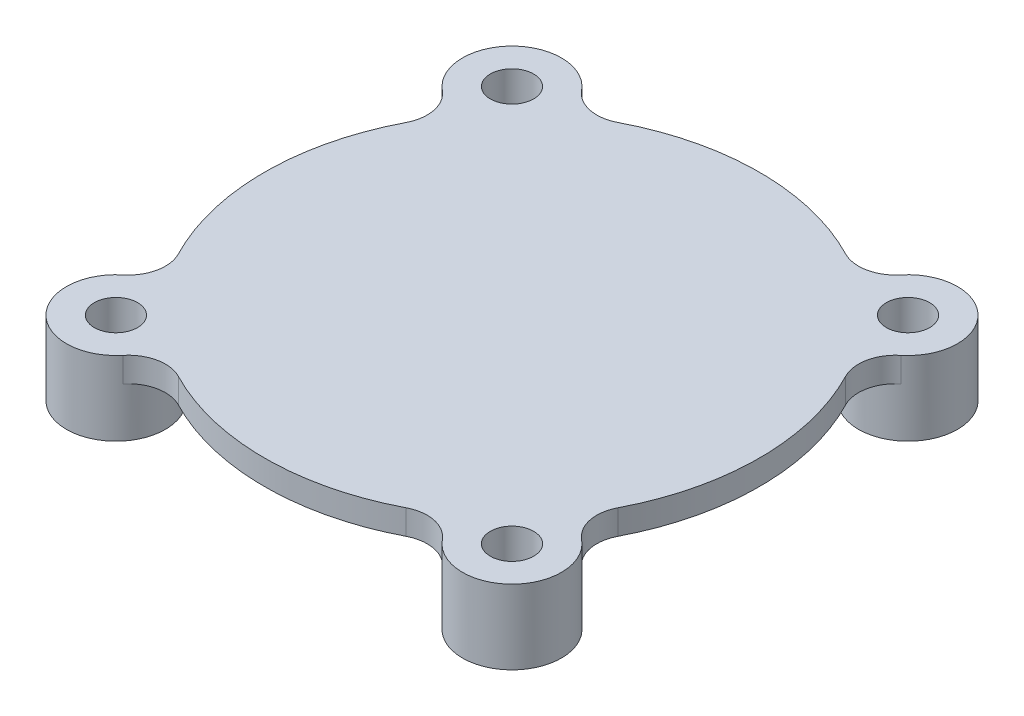
ISO-10303-21;
HEADER;
FILE_DESCRIPTION(('STEP AP214'),'2;1');
FILE_NAME('part.step','',(''),(''),'','','');
FILE_SCHEMA(('AUTOMOTIVE_DESIGN { 1 0 10303 214 1 1 1 1 }'));
ENDSEC;
DATA;
#1=APPLICATION_CONTEXT('core data for automotive mechanical design processes');
#2=APPLICATION_PROTOCOL_DEFINITION('international standard','automotive_design',2000,#1);
#3=PRODUCT_CONTEXT('',#1,'mechanical');
#4=PRODUCT('Part','Part','',(#3));
#5=PRODUCT_RELATED_PRODUCT_CATEGORY('part','',(#4));
#6=PRODUCT_DEFINITION_FORMATION('','',#4);
#7=PRODUCT_DEFINITION_CONTEXT('part definition',#1,'design');
#8=PRODUCT_DEFINITION('design','',#6,#7);
#9=PRODUCT_DEFINITION_SHAPE('','',#8);
#10=(LENGTH_UNIT() NAMED_UNIT(*) SI_UNIT(.MILLI.,.METRE.));
#11=(NAMED_UNIT(*) PLANE_ANGLE_UNIT() SI_UNIT($,.RADIAN.));
#12=(NAMED_UNIT(*) SI_UNIT($,.STERADIAN.) SOLID_ANGLE_UNIT());
#13=UNCERTAINTY_MEASURE_WITH_UNIT(LENGTH_MEASURE(1.E-05),#10,'distance_accuracy_value','');
#14=(GEOMETRIC_REPRESENTATION_CONTEXT(3) GLOBAL_UNCERTAINTY_ASSIGNED_CONTEXT((#13)) GLOBAL_UNIT_ASSIGNED_CONTEXT((#10,
#11,#12)) REPRESENTATION_CONTEXT('',''));
#15=CARTESIAN_POINT('',(0.,0.,0.));
#16=DIRECTION('',(0.,0.,1.));
#17=DIRECTION('',(1.,0.,0.));
#18=AXIS2_PLACEMENT_3D('',#15,#16,#17);
#19=CARTESIAN_POINT('',(-16.,2.,16.));
#20=DIRECTION('',(0.,-1.,0.));
#21=DIRECTION('',(0.,0.,-1.));
#22=AXIS2_PLACEMENT_3D('',#19,#20,#21);
#23=CYLINDRICAL_SURFACE('',#22,4.00000000000022);
#24=CARTESIAN_POINT('',(-16.,2.,16.));
#25=DIRECTION('',(0.,1.,0.));
#26=DIRECTION('',(0.,0.,1.));
#27=AXIS2_PLACEMENT_3D('',#24,#25,#26);
#28=CIRCLE('',#27,4.00000000000022);
#29=CARTESIAN_POINT('',(-18.5282450862276,2.,12.9003263423438));
#30=VERTEX_POINT('',#29);
#31=CARTESIAN_POINT('',(-12.9003263423438,2.,18.5282450862276));
#32=VERTEX_POINT('',#31);
#33=EDGE_CURVE('E175',#30,#32,#28,.T.);
#34=ORIENTED_EDGE('',*,*,#33,.F.);
#35=DIRECTION('',(0.,-1.,0.));
#36=VECTOR('',#35,1.);
#37=CARTESIAN_POINT('',(-18.5282450862276,2.,12.9003263423438));
#38=LINE('',#37,#36);
#39=CARTESIAN_POINT('',(-18.5282450862276,0.,12.9003263423438));
#40=VERTEX_POINT('',#39);
#41=EDGE_CURVE('E169',#30,#40,#38,.T.);
#42=ORIENTED_EDGE('',*,*,#41,.T.);
#43=CARTESIAN_POINT('',(-16.,0.,16.));
#44=DIRECTION('',(0.,1.,0.));
#45=DIRECTION('',(0.,0.,1.));
#46=AXIS2_PLACEMENT_3D('',#43,#44,#45);
#47=CIRCLE('',#46,4.00000000000022);
#48=CARTESIAN_POINT('',(-12.9003263423438,0.,18.5282450862276));
#49=VERTEX_POINT('',#48);
#50=EDGE_CURVE('E150',#49,#40,#47,.T.);
#51=ORIENTED_EDGE('',*,*,#50,.F.);
#52=DIRECTION('',(0.,-1.,0.));
#53=VECTOR('',#52,1.);
#54=CARTESIAN_POINT('',(-12.9003263423438,2.,18.5282450862276));
#55=LINE('',#54,#53);
#56=EDGE_CURVE('E177',#49,#32,#55,.F.);
#57=ORIENTED_EDGE('',*,*,#56,.T.);
#58=EDGE_LOOP('',(#34,#42,#51,#57));
#59=FACE_BOUND('',#58,.T.);
#60=CARTESIAN_POINT('',(-16.,-4.,16.));
#61=DIRECTION('',(0.,1.,0.));
#62=DIRECTION('',(0.,0.,1.));
#63=AXIS2_PLACEMENT_3D('',#60,#61,#62);
#64=CIRCLE('',#63,4.00000000000022);
#65=CARTESIAN_POINT('',(-16.,-4.,20.0000000000002));
#66=VERTEX_POINT('',#65);
#67=EDGE_CURVE('E162',#66,#66,#64,.T.);
#68=ORIENTED_EDGE('',*,*,#67,.T.);
#69=EDGE_LOOP('',(#68));
#70=FACE_BOUND('',#69,.T.);
#71=ADVANCED_FACE('F37',(#59,#70),#23,.T.);
#72=CARTESIAN_POINT('',(0.,2.,0.));
#73=DIRECTION('',(0.,-1.,0.));
#74=DIRECTION('',(0.,0.,-1.));
#75=AXIS2_PLACEMENT_3D('',#72,#73,#74);
#76=CYLINDRICAL_SURFACE('',#75,20.);
#77=CARTESIAN_POINT('',(0.,0.,0.));
#78=DIRECTION('',(0.,1.,0.));
#79=DIRECTION('',(0.,0.,1.));
#80=AXIS2_PLACEMENT_3D('',#77,#78,#79);
#81=CIRCLE('',#80,20.);
#82=CARTESIAN_POINT('',(-9.19614878182761,0.,17.7603729573027));
#83=VERTEX_POINT('',#82);
#84=CARTESIAN_POINT('',(9.19614878182767,0.,17.7603729573027));
#85=VERTEX_POINT('',#84);
#86=EDGE_CURVE('E274',#83,#85,#81,.T.);
#87=ORIENTED_EDGE('',*,*,#86,.T.);
#88=DIRECTION('',(0.,-1.,0.));
#89=VECTOR('',#88,1.);
#90=CARTESIAN_POINT('',(9.19614878182767,2.,17.7603729573027));
#91=LINE('',#90,#89);
#92=CARTESIAN_POINT('',(9.19614878182767,2.,17.7603729573027));
#93=VERTEX_POINT('',#92);
#94=EDGE_CURVE('E52',#85,#93,#91,.F.);
#95=ORIENTED_EDGE('',*,*,#94,.T.);
#96=CARTESIAN_POINT('',(0.,2.,0.));
#97=DIRECTION('',(0.,1.,0.));
#98=DIRECTION('',(0.,0.,1.));
#99=AXIS2_PLACEMENT_3D('',#96,#97,#98);
#100=CIRCLE('',#99,20.);
#101=CARTESIAN_POINT('',(-9.19614878182761,2.,17.7603729573027));
#102=VERTEX_POINT('',#101);
#103=EDGE_CURVE('E269',#102,#93,#100,.T.);
#104=ORIENTED_EDGE('',*,*,#103,.F.);
#105=DIRECTION('',(0.,-1.,0.));
#106=VECTOR('',#105,1.);
#107=CARTESIAN_POINT('',(-9.19614878182761,2.,17.7603729573027));
#108=LINE('',#107,#106);
#109=EDGE_CURVE('E211',#102,#83,#108,.T.);
#110=ORIENTED_EDGE('',*,*,#109,.T.);
#111=EDGE_LOOP('',(#87,#95,#104,#110));
#112=FACE_BOUND('',#111,.T.);
#113=ADVANCED_FACE('F376',(#112),#76,.T.);
#114=CARTESIAN_POINT('',(16.,2.,16.));
#115=DIRECTION('',(0.,-1.,0.));
#116=DIRECTION('',(0.,0.,-1.));
#117=AXIS2_PLACEMENT_3D('',#114,#115,#116);
#118=CYLINDRICAL_SURFACE('',#117,4.00000000000016);
#119=DIRECTION('',(0.,-1.,0.));
#120=VECTOR('',#119,1.);
#121=CARTESIAN_POINT('',(12.9003263423438,2.,18.5282450862275));
#122=LINE('',#121,#120);
#123=CARTESIAN_POINT('',(12.9003263423438,2.,18.5282450862275));
#124=VERTEX_POINT('',#123);
#125=CARTESIAN_POINT('',(12.9003263423438,0.,18.5282450862275));
#126=VERTEX_POINT('',#125);
#127=EDGE_CURVE('E206',#124,#126,#122,.T.);
#128=ORIENTED_EDGE('',*,*,#127,.T.);
#129=CARTESIAN_POINT('',(16.,0.,16.));
#130=DIRECTION('',(0.,1.,0.));
#131=DIRECTION('',(0.,0.,1.));
#132=AXIS2_PLACEMENT_3D('',#129,#130,#131);
#133=CIRCLE('',#132,4.00000000000016);
#134=CARTESIAN_POINT('',(18.5282450862275,0.,12.9003263423438));
#135=VERTEX_POINT('',#134);
#136=EDGE_CURVE('E278',#135,#126,#133,.T.);
#137=ORIENTED_EDGE('',*,*,#136,.F.);
#138=DIRECTION('',(0.,-1.,0.));
#139=VECTOR('',#138,1.);
#140=CARTESIAN_POINT('',(18.5282450862275,2.,12.9003263423438));
#141=LINE('',#140,#139);
#142=CARTESIAN_POINT('',(18.5282450862275,2.,12.9003263423438));
#143=VERTEX_POINT('',#142);
#144=EDGE_CURVE('E209',#135,#143,#141,.F.);
#145=ORIENTED_EDGE('',*,*,#144,.T.);
#146=CARTESIAN_POINT('',(16.,2.,16.));
#147=DIRECTION('',(0.,1.,0.));
#148=DIRECTION('',(0.,0.,1.));
#149=AXIS2_PLACEMENT_3D('',#146,#147,#148);
#150=CIRCLE('',#149,4.00000000000016);
#151=EDGE_CURVE('E282',#124,#143,#150,.T.);
#152=ORIENTED_EDGE('',*,*,#151,.F.);
#153=EDGE_LOOP('',(#128,#137,#145,#152));
#154=FACE_BOUND('',#153,.T.);
#155=CARTESIAN_POINT('',(16.,-4.,16.));
#156=DIRECTION('',(0.,1.,0.));
#157=DIRECTION('',(0.,0.,1.));
#158=AXIS2_PLACEMENT_3D('',#155,#156,#157);
#159=CIRCLE('',#158,4.00000000000016);
#160=CARTESIAN_POINT('',(16.,-4.,20.0000000000002));
#161=VERTEX_POINT('',#160);
#162=EDGE_CURVE('E275',#161,#161,#159,.T.);
#163=ORIENTED_EDGE('',*,*,#162,.T.);
#164=EDGE_LOOP('',(#163));
#165=FACE_BOUND('',#164,.T.);
#166=ADVANCED_FACE('F381',(#154,#165),#118,.T.);
#167=CARTESIAN_POINT('',(17.7603729573027,0.,9.19614878182765));
#168=VERTEX_POINT('',#167);
#169=CARTESIAN_POINT('',(17.7603729573027,0.,-9.19614878182772));
#170=VERTEX_POINT('',#169);
#171=EDGE_CURVE('E254',#168,#170,#81,.T.);
#172=ORIENTED_EDGE('',*,*,#171,.T.);
#173=DIRECTION('',(0.,-1.,0.));
#174=VECTOR('',#173,1.);
#175=CARTESIAN_POINT('',(17.7603729573027,2.,-9.19614878182772));
#176=LINE('',#175,#174);
#177=CARTESIAN_POINT('',(17.7603729573027,2.,-9.19614878182772));
#178=VERTEX_POINT('',#177);
#179=EDGE_CURVE('E204',#170,#178,#176,.F.);
#180=ORIENTED_EDGE('',*,*,#179,.T.);
#181=CARTESIAN_POINT('',(17.7603729573027,2.,9.19614878182765));
#182=VERTEX_POINT('',#181);
#183=EDGE_CURVE('E271',#182,#178,#100,.T.);
#184=ORIENTED_EDGE('',*,*,#183,.F.);
#185=DIRECTION('',(0.,-1.,0.));
#186=VECTOR('',#185,1.);
#187=CARTESIAN_POINT('',(17.7603729573027,2.,9.19614878182765));
#188=LINE('',#187,#186);
#189=EDGE_CURVE('E201',#182,#168,#188,.T.);
#190=ORIENTED_EDGE('',*,*,#189,.T.);
#191=EDGE_LOOP('',(#172,#180,#184,#190));
#192=FACE_BOUND('',#191,.T.);
#193=ADVANCED_FACE('F309',(#192),#76,.T.);
#194=CARTESIAN_POINT('',(16.,2.,-16.));
#195=DIRECTION('',(0.,-1.,0.));
#196=DIRECTION('',(0.,0.,-1.));
#197=AXIS2_PLACEMENT_3D('',#194,#195,#196);
#198=CYLINDRICAL_SURFACE('',#197,4.00000000000008);
#199=DIRECTION('',(0.,-1.,0.));
#200=VECTOR('',#199,1.);
#201=CARTESIAN_POINT('',(18.5282450862275,2.,-12.9003263423439));
#202=LINE('',#201,#200);
#203=CARTESIAN_POINT('',(18.5282450862275,2.,-12.9003263423439));
#204=VERTEX_POINT('',#203);
#205=CARTESIAN_POINT('',(18.5282450862275,0.,-12.9003263423439));
#206=VERTEX_POINT('',#205);
#207=EDGE_CURVE('E196',#204,#206,#202,.T.);
#208=ORIENTED_EDGE('',*,*,#207,.T.);
#209=CARTESIAN_POINT('',(16.,0.,-16.));
#210=DIRECTION('',(0.,1.,0.));
#211=DIRECTION('',(0.,0.,1.));
#212=AXIS2_PLACEMENT_3D('',#209,#210,#211);
#213=CIRCLE('',#212,4.00000000000008);
#214=CARTESIAN_POINT('',(12.9003263423439,0.,-18.5282450862275));
#215=VERTEX_POINT('',#214);
#216=EDGE_CURVE('E298',#215,#206,#213,.T.);
#217=ORIENTED_EDGE('',*,*,#216,.F.);
#218=DIRECTION('',(0.,-1.,0.));
#219=VECTOR('',#218,1.);
#220=CARTESIAN_POINT('',(12.9003263423439,2.,-18.5282450862275));
#221=LINE('',#220,#219);
#222=CARTESIAN_POINT('',(12.9003263423439,2.,-18.5282450862275));
#223=VERTEX_POINT('',#222);
#224=EDGE_CURVE('E199',#215,#223,#221,.F.);
#225=ORIENTED_EDGE('',*,*,#224,.T.);
#226=CARTESIAN_POINT('',(16.,2.,-16.));
#227=DIRECTION('',(0.,1.,0.));
#228=DIRECTION('',(0.,0.,1.));
#229=AXIS2_PLACEMENT_3D('',#226,#227,#228);
#230=CIRCLE('',#229,4.00000000000008);
#231=EDGE_CURVE('E270',#204,#223,#230,.T.);
#232=ORIENTED_EDGE('',*,*,#231,.F.);
#233=EDGE_LOOP('',(#208,#217,#225,#232));
#234=FACE_BOUND('',#233,.T.);
#235=CARTESIAN_POINT('',(16.,-4.,-16.));
#236=DIRECTION('',(0.,1.,0.));
#237=DIRECTION('',(0.,0.,1.));
#238=AXIS2_PLACEMENT_3D('',#235,#236,#237);
#239=CIRCLE('',#238,4.00000000000008);
#240=CARTESIAN_POINT('',(16.,-4.,-11.9999999999999));
#241=VERTEX_POINT('',#240);
#242=EDGE_CURVE('E301',#241,#241,#239,.T.);
#243=ORIENTED_EDGE('',*,*,#242,.T.);
#244=EDGE_LOOP('',(#243));
#245=FACE_BOUND('',#244,.T.);
#246=ADVANCED_FACE('F306',(#234,#245),#198,.T.);
#247=CARTESIAN_POINT('',(9.19614878182773,2.,-17.7603729573027));
#248=VERTEX_POINT('',#247);
#249=CARTESIAN_POINT('',(-9.19614878182778,2.,-17.7603729573027));
#250=VERTEX_POINT('',#249);
#251=EDGE_CURVE('E262',#248,#250,#100,.T.);
#252=ORIENTED_EDGE('',*,*,#251,.F.);
#253=DIRECTION('',(0.,-1.,0.));
#254=VECTOR('',#253,1.);
#255=CARTESIAN_POINT('',(9.19614878182773,2.,-17.7603729573027));
#256=LINE('',#255,#254);
#257=CARTESIAN_POINT('',(9.19614878182773,0.,-17.7603729573027));
#258=VERTEX_POINT('',#257);
#259=EDGE_CURVE('E193',#248,#258,#256,.T.);
#260=ORIENTED_EDGE('',*,*,#259,.T.);
#261=CARTESIAN_POINT('',(-9.19614878182778,0.,-17.7603729573027));
#262=VERTEX_POINT('',#261);
#263=EDGE_CURVE('E243',#258,#262,#81,.T.);
#264=ORIENTED_EDGE('',*,*,#263,.T.);
#265=DIRECTION('',(0.,-1.,0.));
#266=VECTOR('',#265,1.);
#267=CARTESIAN_POINT('',(-9.19614878182778,2.,-17.7603729573027));
#268=LINE('',#267,#266);
#269=EDGE_CURVE('E191',#262,#250,#268,.F.);
#270=ORIENTED_EDGE('',*,*,#269,.T.);
#271=EDGE_LOOP('',(#252,#260,#264,#270));
#272=FACE_BOUND('',#271,.T.);
#273=ADVANCED_FACE('F250',(#272),#76,.T.);
#274=CARTESIAN_POINT('',(-16.,2.,-16.));
#275=DIRECTION('',(0.,-1.,0.));
#276=DIRECTION('',(0.,0.,-1.));
#277=AXIS2_PLACEMENT_3D('',#274,#275,#276);
#278=CYLINDRICAL_SURFACE('',#277,4.);
#279=DIRECTION('',(0.,-1.,0.));
#280=VECTOR('',#279,1.);
#281=CARTESIAN_POINT('',(-12.900326342344,2.,-18.5282450862275));
#282=LINE('',#281,#280);
#283=CARTESIAN_POINT('',(-12.900326342344,2.,-18.5282450862275));
#284=VERTEX_POINT('',#283);
#285=CARTESIAN_POINT('',(-12.900326342344,0.,-18.5282450862275));
#286=VERTEX_POINT('',#285);
#287=EDGE_CURVE('E186',#284,#286,#282,.T.);
#288=ORIENTED_EDGE('',*,*,#287,.T.);
#289=CARTESIAN_POINT('',(-16.,0.,-16.));
#290=DIRECTION('',(0.,1.,0.));
#291=DIRECTION('',(0.,0.,1.));
#292=AXIS2_PLACEMENT_3D('',#289,#290,#291);
#293=CIRCLE('',#292,4.);
#294=CARTESIAN_POINT('',(-18.5282450862275,0.,-12.900326342344));
#295=VERTEX_POINT('',#294);
#296=EDGE_CURVE('E244',#295,#286,#293,.T.);
#297=ORIENTED_EDGE('',*,*,#296,.F.);
#298=DIRECTION('',(0.,-1.,0.));
#299=VECTOR('',#298,1.);
#300=CARTESIAN_POINT('',(-18.5282450862275,2.,-12.900326342344));
#301=LINE('',#300,#299);
#302=CARTESIAN_POINT('',(-18.5282450862275,2.,-12.900326342344));
#303=VERTEX_POINT('',#302);
#304=EDGE_CURVE('E189',#295,#303,#301,.F.);
#305=ORIENTED_EDGE('',*,*,#304,.T.);
#306=CARTESIAN_POINT('',(-16.,2.,-16.));
#307=DIRECTION('',(0.,1.,0.));
#308=DIRECTION('',(0.,0.,1.));
#309=AXIS2_PLACEMENT_3D('',#306,#307,#308);
#310=CIRCLE('',#309,4.);
#311=EDGE_CURVE('E260',#284,#303,#310,.T.);
#312=ORIENTED_EDGE('',*,*,#311,.F.);
#313=EDGE_LOOP('',(#288,#297,#305,#312));
#314=FACE_BOUND('',#313,.T.);
#315=CARTESIAN_POINT('',(-16.,-4.,-16.));
#316=DIRECTION('',(0.,1.,0.));
#317=DIRECTION('',(0.,0.,1.));
#318=AXIS2_PLACEMENT_3D('',#315,#316,#317);
#319=CIRCLE('',#318,4.);
#320=CARTESIAN_POINT('',(-16.,-4.,-12.));
#321=VERTEX_POINT('',#320);
#322=EDGE_CURVE('E161',#321,#321,#319,.T.);
#323=ORIENTED_EDGE('',*,*,#322,.T.);
#324=EDGE_LOOP('',(#323));
#325=FACE_BOUND('',#324,.T.);
#326=ADVANCED_FACE('F264',(#314,#325),#278,.T.);
#327=CARTESIAN_POINT('',(-17.7603729573027,0.,-9.19614878182778));
#328=VERTEX_POINT('',#327);
#329=CARTESIAN_POINT('',(-17.7603729573027,0.,9.19614878182762));
#330=VERTEX_POINT('',#329);
#331=EDGE_CURVE('E253',#328,#330,#81,.T.);
#332=ORIENTED_EDGE('',*,*,#331,.T.);
#333=DIRECTION('',(0.,-1.,0.));
#334=VECTOR('',#333,1.);
#335=CARTESIAN_POINT('',(-17.7603729573027,2.,9.19614878182762));
#336=LINE('',#335,#334);
#337=CARTESIAN_POINT('',(-17.7603729573027,2.,9.19614878182762));
#338=VERTEX_POINT('',#337);
#339=EDGE_CURVE('E170',#330,#338,#336,.F.);
#340=ORIENTED_EDGE('',*,*,#339,.T.);
#341=CARTESIAN_POINT('',(-17.7603729573027,2.,-9.19614878182778));
#342=VERTEX_POINT('',#341);
#343=EDGE_CURVE('E181',#342,#338,#100,.T.);
#344=ORIENTED_EDGE('',*,*,#343,.F.);
#345=DIRECTION('',(0.,-1.,0.));
#346=VECTOR('',#345,1.);
#347=CARTESIAN_POINT('',(-17.7603729573027,2.,-9.19614878182778));
#348=LINE('',#347,#346);
#349=EDGE_CURVE('E176',#342,#328,#348,.T.);
#350=ORIENTED_EDGE('',*,*,#349,.T.);
#351=EDGE_LOOP('',(#332,#340,#344,#350));
#352=FACE_BOUND('',#351,.T.);
#353=ADVANCED_FACE('F350',(#352),#76,.T.);
#354=CARTESIAN_POINT('',(0.,2.,0.));
#355=DIRECTION('',(0.,1.,0.));
#356=DIRECTION('',(0.,0.,1.));
#357=AXIS2_PLACEMENT_3D('',#354,#355,#356);
#358=PLANE('',#357);
#359=CARTESIAN_POINT('',(-16.,2.,-16.));
#360=DIRECTION('',(0.,1.,0.));
#361=DIRECTION('',(0.,0.,1.));
#362=AXIS2_PLACEMENT_3D('',#359,#360,#361);
#363=CIRCLE('',#362,1.74999999999999);
#364=CARTESIAN_POINT('',(-16.,2.,-14.25));
#365=VERTEX_POINT('',#364);
#366=EDGE_CURVE('E342',#365,#365,#363,.T.);
#367=ORIENTED_EDGE('',*,*,#366,.F.);
#368=EDGE_LOOP('',(#367));
#369=FACE_BOUND('',#368,.T.);
#370=CARTESIAN_POINT('',(16.,2.,-16.));
#371=DIRECTION('',(0.,1.,0.));
#372=DIRECTION('',(0.,0.,1.));
#373=AXIS2_PLACEMENT_3D('',#370,#371,#372);
#374=CIRCLE('',#373,1.74999999999999);
#375=CARTESIAN_POINT('',(16.,2.,-14.25));
#376=VERTEX_POINT('',#375);
#377=EDGE_CURVE('E336',#376,#376,#374,.T.);
#378=ORIENTED_EDGE('',*,*,#377,.F.);
#379=EDGE_LOOP('',(#378));
#380=FACE_BOUND('',#379,.T.);
#381=CARTESIAN_POINT('',(16.,2.,16.));
#382=DIRECTION('',(0.,1.,0.));
#383=DIRECTION('',(0.,0.,1.));
#384=AXIS2_PLACEMENT_3D('',#381,#382,#383);
#385=CIRCLE('',#384,1.74999999999999);
#386=CARTESIAN_POINT('',(16.,2.,17.75));
#387=VERTEX_POINT('',#386);
#388=EDGE_CURVE('E330',#387,#387,#385,.T.);
#389=ORIENTED_EDGE('',*,*,#388,.F.);
#390=EDGE_LOOP('',(#389));
#391=FACE_BOUND('',#390,.T.);
#392=CARTESIAN_POINT('',(-16.,2.,16.));
#393=DIRECTION('',(0.,1.,0.));
#394=DIRECTION('',(0.,0.,1.));
#395=AXIS2_PLACEMENT_3D('',#392,#393,#394);
#396=CIRCLE('',#395,1.74999999999999);
#397=CARTESIAN_POINT('',(-16.,2.,17.75));
#398=VERTEX_POINT('',#397);
#399=EDGE_CURVE('E324',#398,#398,#396,.T.);
#400=ORIENTED_EDGE('',*,*,#399,.F.);
#401=EDGE_LOOP('',(#400));
#402=FACE_BOUND('',#401,.T.);
#403=ORIENTED_EDGE('',*,*,#343,.T.);
#404=CARTESIAN_POINT('',(-20.4244289008982,2.,10.5755710991018));
#405=DIRECTION('',(0.,1.,0.));
#406=DIRECTION('',(0.,0.,1.));
#407=AXIS2_PLACEMENT_3D('',#404,#405,#406);
#408=CIRCLE('',#407,3.);
#409=EDGE_CURVE('E171',#338,#30,#408,.F.);
#410=ORIENTED_EDGE('',*,*,#409,.T.);
#411=ORIENTED_EDGE('',*,*,#33,.T.);
#412=CARTESIAN_POINT('',(-10.5755710991017,2.,20.4244289008982));
#413=DIRECTION('',(0.,1.,0.));
#414=DIRECTION('',(0.,0.,1.));
#415=AXIS2_PLACEMENT_3D('',#412,#413,#414);
#416=CIRCLE('',#415,3.);
#417=EDGE_CURVE('E59',#32,#102,#416,.F.);
#418=ORIENTED_EDGE('',*,*,#417,.T.);
#419=ORIENTED_EDGE('',*,*,#103,.T.);
#420=CARTESIAN_POINT('',(10.5755710991018,2.,20.4244289008981));
#421=DIRECTION('',(0.,1.,0.));
#422=DIRECTION('',(0.,0.,1.));
#423=AXIS2_PLACEMENT_3D('',#420,#421,#422);
#424=CIRCLE('',#423,3.);
#425=EDGE_CURVE('E237',#93,#124,#424,.F.);
#426=ORIENTED_EDGE('',*,*,#425,.T.);
#427=ORIENTED_EDGE('',*,*,#151,.T.);
#428=CARTESIAN_POINT('',(20.4244289008981,2.,10.5755710991018));
#429=DIRECTION('',(0.,1.,0.));
#430=DIRECTION('',(0.,0.,1.));
#431=AXIS2_PLACEMENT_3D('',#428,#429,#430);
#432=CIRCLE('',#431,3.);
#433=EDGE_CURVE('E233',#143,#182,#432,.F.);
#434=ORIENTED_EDGE('',*,*,#433,.T.);
#435=ORIENTED_EDGE('',*,*,#183,.T.);
#436=CARTESIAN_POINT('',(20.4244289008981,2.,-10.5755710991019));
#437=DIRECTION('',(0.,1.,0.));
#438=DIRECTION('',(0.,0.,1.));
#439=AXIS2_PLACEMENT_3D('',#436,#437,#438);
#440=CIRCLE('',#439,3.);
#441=EDGE_CURVE('E228',#178,#204,#440,.F.);
#442=ORIENTED_EDGE('',*,*,#441,.T.);
#443=ORIENTED_EDGE('',*,*,#231,.T.);
#444=CARTESIAN_POINT('',(10.5755710991019,2.,-20.4244289008981));
#445=DIRECTION('',(0.,1.,0.));
#446=DIRECTION('',(0.,0.,1.));
#447=AXIS2_PLACEMENT_3D('',#444,#445,#446);
#448=CIRCLE('',#447,3.);
#449=EDGE_CURVE('E224',#223,#248,#448,.F.);
#450=ORIENTED_EDGE('',*,*,#449,.T.);
#451=ORIENTED_EDGE('',*,*,#251,.T.);
#452=CARTESIAN_POINT('',(-10.5755710991019,2.,-20.4244289008981));
#453=DIRECTION('',(0.,1.,0.));
#454=DIRECTION('',(0.,0.,1.));
#455=AXIS2_PLACEMENT_3D('',#452,#453,#454);
#456=CIRCLE('',#455,3.);
#457=EDGE_CURVE('E11',#250,#284,#456,.F.);
#458=ORIENTED_EDGE('',*,*,#457,.T.);
#459=ORIENTED_EDGE('',*,*,#311,.T.);
#460=CARTESIAN_POINT('',(-20.4244289008981,2.,-10.575571099102));
#461=DIRECTION('',(0.,1.,0.));
#462=DIRECTION('',(0.,0.,1.));
#463=AXIS2_PLACEMENT_3D('',#460,#461,#462);
#464=CIRCLE('',#463,3.);
#465=EDGE_CURVE('E219',#303,#342,#464,.F.);
#466=ORIENTED_EDGE('',*,*,#465,.T.);
#467=EDGE_LOOP('',(#403,#410,#411,#418,#419,#426,#427,#434,#435,#442,#443,#450,#451,#458,#459,#466));
#468=FACE_BOUND('',#467,.T.);
#469=ADVANCED_FACE('F259',(#369,#380,#391,#402,#468),#358,.T.);
#470=CARTESIAN_POINT('',(0.,0.,0.));
#471=DIRECTION('',(0.,1.,0.));
#472=DIRECTION('',(0.,0.,1.));
#473=AXIS2_PLACEMENT_3D('',#470,#471,#472);
#474=PLANE('',#473);
#475=CARTESIAN_POINT('',(-10.5755710991017,0.,20.4244289008982));
#476=DIRECTION('',(0.,1.,0.));
#477=DIRECTION('',(0.,0.,1.));
#478=AXIS2_PLACEMENT_3D('',#475,#476,#477);
#479=CIRCLE('',#478,3.);
#480=EDGE_CURVE('E157',#83,#49,#479,.T.);
#481=ORIENTED_EDGE('',*,*,#480,.T.);
#482=ORIENTED_EDGE('',*,*,#50,.T.);
#483=CARTESIAN_POINT('',(-20.4244289008982,0.,10.5755710991018));
#484=DIRECTION('',(0.,1.,0.));
#485=DIRECTION('',(0.,0.,1.));
#486=AXIS2_PLACEMENT_3D('',#483,#484,#485);
#487=CIRCLE('',#486,3.);
#488=EDGE_CURVE('E154',#40,#330,#487,.T.);
#489=ORIENTED_EDGE('',*,*,#488,.T.);
#490=ORIENTED_EDGE('',*,*,#331,.F.);
#491=CARTESIAN_POINT('',(-20.4244289008981,0.,-10.575571099102));
#492=DIRECTION('',(0.,1.,0.));
#493=DIRECTION('',(0.,0.,1.));
#494=AXIS2_PLACEMENT_3D('',#491,#492,#493);
#495=CIRCLE('',#494,3.);
#496=EDGE_CURVE('E216',#328,#295,#495,.T.);
#497=ORIENTED_EDGE('',*,*,#496,.T.);
#498=ORIENTED_EDGE('',*,*,#296,.T.);
#499=CARTESIAN_POINT('',(-10.5755710991019,0.,-20.4244289008981));
#500=DIRECTION('',(0.,1.,0.));
#501=DIRECTION('',(0.,0.,1.));
#502=AXIS2_PLACEMENT_3D('',#499,#500,#501);
#503=CIRCLE('',#502,3.);
#504=EDGE_CURVE('E45',#286,#262,#503,.T.);
#505=ORIENTED_EDGE('',*,*,#504,.T.);
#506=ORIENTED_EDGE('',*,*,#263,.F.);
#507=CARTESIAN_POINT('',(10.5755710991019,0.,-20.4244289008981));
#508=DIRECTION('',(0.,1.,0.));
#509=DIRECTION('',(0.,0.,1.));
#510=AXIS2_PLACEMENT_3D('',#507,#508,#509);
#511=CIRCLE('',#510,3.);
#512=EDGE_CURVE('E221',#258,#215,#511,.T.);
#513=ORIENTED_EDGE('',*,*,#512,.T.);
#514=ORIENTED_EDGE('',*,*,#216,.T.);
#515=CARTESIAN_POINT('',(20.4244289008981,0.,-10.5755710991019));
#516=DIRECTION('',(0.,1.,0.));
#517=DIRECTION('',(0.,0.,1.));
#518=AXIS2_PLACEMENT_3D('',#515,#516,#517);
#519=CIRCLE('',#518,3.);
#520=EDGE_CURVE('E226',#206,#170,#519,.T.);
#521=ORIENTED_EDGE('',*,*,#520,.T.);
#522=ORIENTED_EDGE('',*,*,#171,.F.);
#523=CARTESIAN_POINT('',(20.4244289008981,0.,10.5755710991018));
#524=DIRECTION('',(0.,1.,0.));
#525=DIRECTION('',(0.,0.,1.));
#526=AXIS2_PLACEMENT_3D('',#523,#524,#525);
#527=CIRCLE('',#526,3.);
#528=EDGE_CURVE('E230',#168,#135,#527,.T.);
#529=ORIENTED_EDGE('',*,*,#528,.T.);
#530=ORIENTED_EDGE('',*,*,#136,.T.);
#531=CARTESIAN_POINT('',(10.5755710991018,0.,20.4244289008981));
#532=DIRECTION('',(0.,1.,0.));
#533=DIRECTION('',(0.,0.,1.));
#534=AXIS2_PLACEMENT_3D('',#531,#532,#533);
#535=CIRCLE('',#534,3.);
#536=EDGE_CURVE('E235',#126,#85,#535,.T.);
#537=ORIENTED_EDGE('',*,*,#536,.T.);
#538=ORIENTED_EDGE('',*,*,#86,.F.);
#539=EDGE_LOOP('',(#481,#482,#489,#490,#497,#498,#505,#506,#513,#514,#521,#522,#529,#530,#537,#538));
#540=FACE_BOUND('',#539,.T.);
#541=ADVANCED_FACE('F152',(#540),#474,.F.);
#542=CARTESIAN_POINT('',(-20.4244289008982,2.,10.5755710991018));
#543=DIRECTION('',(0.,1.,0.));
#544=DIRECTION('',(0.,0.,1.));
#545=AXIS2_PLACEMENT_3D('',#542,#543,#544);
#546=CYLINDRICAL_SURFACE('',#545,3.);
#547=ORIENTED_EDGE('',*,*,#409,.F.);
#548=ORIENTED_EDGE('',*,*,#339,.F.);
#549=ORIENTED_EDGE('',*,*,#488,.F.);
#550=ORIENTED_EDGE('',*,*,#41,.F.);
#551=EDGE_LOOP('',(#547,#548,#549,#550));
#552=FACE_BOUND('',#551,.T.);
#553=ADVANCED_FACE('F168',(#552),#546,.F.);
#554=CARTESIAN_POINT('',(-20.4244289008981,2.,-10.575571099102));
#555=DIRECTION('',(0.,1.,0.));
#556=DIRECTION('',(0.,0.,1.));
#557=AXIS2_PLACEMENT_3D('',#554,#555,#556);
#558=CYLINDRICAL_SURFACE('',#557,3.);
#559=ORIENTED_EDGE('',*,*,#465,.F.);
#560=ORIENTED_EDGE('',*,*,#304,.F.);
#561=ORIENTED_EDGE('',*,*,#496,.F.);
#562=ORIENTED_EDGE('',*,*,#349,.F.);
#563=EDGE_LOOP('',(#559,#560,#561,#562));
#564=FACE_BOUND('',#563,.T.);
#565=ADVANCED_FACE('F387',(#564),#558,.F.);
#566=CARTESIAN_POINT('',(10.5755710991019,2.,-20.4244289008981));
#567=DIRECTION('',(0.,1.,0.));
#568=DIRECTION('',(0.,0.,1.));
#569=AXIS2_PLACEMENT_3D('',#566,#567,#568);
#570=CYLINDRICAL_SURFACE('',#569,3.);
#571=ORIENTED_EDGE('',*,*,#449,.F.);
#572=ORIENTED_EDGE('',*,*,#224,.F.);
#573=ORIENTED_EDGE('',*,*,#512,.F.);
#574=ORIENTED_EDGE('',*,*,#259,.F.);
#575=EDGE_LOOP('',(#571,#572,#573,#574));
#576=FACE_BOUND('',#575,.T.);
#577=ADVANCED_FACE('F297',(#576),#570,.F.);
#578=CARTESIAN_POINT('',(20.4244289008981,2.,-10.5755710991019));
#579=DIRECTION('',(0.,1.,0.));
#580=DIRECTION('',(0.,0.,1.));
#581=AXIS2_PLACEMENT_3D('',#578,#579,#580);
#582=CYLINDRICAL_SURFACE('',#581,3.);
#583=ORIENTED_EDGE('',*,*,#441,.F.);
#584=ORIENTED_EDGE('',*,*,#179,.F.);
#585=ORIENTED_EDGE('',*,*,#520,.F.);
#586=ORIENTED_EDGE('',*,*,#207,.F.);
#587=EDGE_LOOP('',(#583,#584,#585,#586));
#588=FACE_BOUND('',#587,.T.);
#589=ADVANCED_FACE('F305',(#588),#582,.F.);
#590=CARTESIAN_POINT('',(20.4244289008981,2.,10.5755710991018));
#591=DIRECTION('',(0.,1.,0.));
#592=DIRECTION('',(0.,0.,1.));
#593=AXIS2_PLACEMENT_3D('',#590,#591,#592);
#594=CYLINDRICAL_SURFACE('',#593,3.);
#595=ORIENTED_EDGE('',*,*,#433,.F.);
#596=ORIENTED_EDGE('',*,*,#144,.F.);
#597=ORIENTED_EDGE('',*,*,#528,.F.);
#598=ORIENTED_EDGE('',*,*,#189,.F.);
#599=EDGE_LOOP('',(#595,#596,#597,#598));
#600=FACE_BOUND('',#599,.T.);
#601=ADVANCED_FACE('F395',(#600),#594,.F.);
#602=CARTESIAN_POINT('',(10.5755710991018,2.,20.4244289008981));
#603=DIRECTION('',(0.,1.,0.));
#604=DIRECTION('',(0.,0.,1.));
#605=AXIS2_PLACEMENT_3D('',#602,#603,#604);
#606=CYLINDRICAL_SURFACE('',#605,3.);
#607=ORIENTED_EDGE('',*,*,#425,.F.);
#608=ORIENTED_EDGE('',*,*,#94,.F.);
#609=ORIENTED_EDGE('',*,*,#536,.F.);
#610=ORIENTED_EDGE('',*,*,#127,.F.);
#611=EDGE_LOOP('',(#607,#608,#609,#610));
#612=FACE_BOUND('',#611,.T.);
#613=ADVANCED_FACE('F398',(#612),#606,.F.);
#614=CARTESIAN_POINT('',(-10.5755710991017,2.,20.4244289008982));
#615=DIRECTION('',(0.,1.,0.));
#616=DIRECTION('',(0.,0.,1.));
#617=AXIS2_PLACEMENT_3D('',#614,#615,#616);
#618=CYLINDRICAL_SURFACE('',#617,3.);
#619=ORIENTED_EDGE('',*,*,#417,.F.);
#620=ORIENTED_EDGE('',*,*,#56,.F.);
#621=ORIENTED_EDGE('',*,*,#480,.F.);
#622=ORIENTED_EDGE('',*,*,#109,.F.);
#623=EDGE_LOOP('',(#619,#620,#621,#622));
#624=FACE_BOUND('',#623,.T.);
#625=ADVANCED_FACE('F401',(#624),#618,.F.);
#626=CARTESIAN_POINT('',(-10.5755710991019,2.,-20.4244289008981));
#627=DIRECTION('',(0.,1.,0.));
#628=DIRECTION('',(0.,0.,1.));
#629=AXIS2_PLACEMENT_3D('',#626,#627,#628);
#630=CYLINDRICAL_SURFACE('',#629,3.);
#631=ORIENTED_EDGE('',*,*,#457,.F.);
#632=ORIENTED_EDGE('',*,*,#269,.F.);
#633=ORIENTED_EDGE('',*,*,#504,.F.);
#634=ORIENTED_EDGE('',*,*,#287,.F.);
#635=EDGE_LOOP('',(#631,#632,#633,#634));
#636=FACE_BOUND('',#635,.T.);
#637=ADVANCED_FACE('F39',(#636),#630,.F.);
#638=CARTESIAN_POINT('',(16.,-4.,16.));
#639=DIRECTION('',(0.,1.,0.));
#640=DIRECTION('',(0.,0.,1.));
#641=AXIS2_PLACEMENT_3D('',#638,#639,#640);
#642=PLANE('',#641);
#643=CARTESIAN_POINT('',(16.,-4.,16.));
#644=DIRECTION('',(0.,1.,0.));
#645=DIRECTION('',(0.,0.,1.));
#646=AXIS2_PLACEMENT_3D('',#643,#644,#645);
#647=CIRCLE('',#646,1.75);
#648=CARTESIAN_POINT('',(16.,-4.,17.75));
#649=VERTEX_POINT('',#648);
#650=EDGE_CURVE('E327',#649,#649,#647,.T.);
#651=ORIENTED_EDGE('',*,*,#650,.T.);
#652=EDGE_LOOP('',(#651));
#653=FACE_BOUND('',#652,.T.);
#654=ORIENTED_EDGE('',*,*,#162,.F.);
#655=EDGE_LOOP('',(#654));
#656=FACE_BOUND('',#655,.T.);
#657=ADVANCED_FACE('F408',(#653,#656),#642,.F.);
#658=CARTESIAN_POINT('',(16.,-4.,-16.));
#659=DIRECTION('',(0.,1.,0.));
#660=DIRECTION('',(0.,0.,1.));
#661=AXIS2_PLACEMENT_3D('',#658,#659,#660);
#662=PLANE('',#661);
#663=CARTESIAN_POINT('',(16.,-4.,-16.));
#664=DIRECTION('',(0.,1.,0.));
#665=DIRECTION('',(0.,0.,1.));
#666=AXIS2_PLACEMENT_3D('',#663,#664,#665);
#667=CIRCLE('',#666,1.75);
#668=CARTESIAN_POINT('',(16.,-4.,-14.25));
#669=VERTEX_POINT('',#668);
#670=EDGE_CURVE('E333',#669,#669,#667,.T.);
#671=ORIENTED_EDGE('',*,*,#670,.T.);
#672=EDGE_LOOP('',(#671));
#673=FACE_BOUND('',#672,.T.);
#674=ORIENTED_EDGE('',*,*,#242,.F.);
#675=EDGE_LOOP('',(#674));
#676=FACE_BOUND('',#675,.T.);
#677=ADVANCED_FACE('F485',(#673,#676),#662,.F.);
#678=CARTESIAN_POINT('',(-16.,-4.,-16.));
#679=DIRECTION('',(0.,1.,0.));
#680=DIRECTION('',(0.,0.,1.));
#681=AXIS2_PLACEMENT_3D('',#678,#679,#680);
#682=PLANE('',#681);
#683=CARTESIAN_POINT('',(-16.,-4.,-16.));
#684=DIRECTION('',(0.,1.,0.));
#685=DIRECTION('',(0.,0.,1.));
#686=AXIS2_PLACEMENT_3D('',#683,#684,#685);
#687=CIRCLE('',#686,1.75);
#688=CARTESIAN_POINT('',(-16.,-4.,-14.25));
#689=VERTEX_POINT('',#688);
#690=EDGE_CURVE('E339',#689,#689,#687,.T.);
#691=ORIENTED_EDGE('',*,*,#690,.T.);
#692=EDGE_LOOP('',(#691));
#693=FACE_BOUND('',#692,.T.);
#694=ORIENTED_EDGE('',*,*,#322,.F.);
#695=EDGE_LOOP('',(#694));
#696=FACE_BOUND('',#695,.T.);
#697=ADVANCED_FACE('F371',(#693,#696),#682,.F.);
#698=CARTESIAN_POINT('',(-16.,-4.,16.));
#699=DIRECTION('',(0.,1.,0.));
#700=DIRECTION('',(0.,0.,1.));
#701=AXIS2_PLACEMENT_3D('',#698,#699,#700);
#702=PLANE('',#701);
#703=CARTESIAN_POINT('',(-16.,-4.,16.));
#704=DIRECTION('',(0.,1.,0.));
#705=DIRECTION('',(0.,0.,1.));
#706=AXIS2_PLACEMENT_3D('',#703,#704,#705);
#707=CIRCLE('',#706,1.75);
#708=CARTESIAN_POINT('',(-16.,-4.,17.75));
#709=VERTEX_POINT('',#708);
#710=EDGE_CURVE('E320',#709,#709,#707,.T.);
#711=ORIENTED_EDGE('',*,*,#710,.T.);
#712=EDGE_LOOP('',(#711));
#713=FACE_BOUND('',#712,.T.);
#714=ORIENTED_EDGE('',*,*,#67,.F.);
#715=EDGE_LOOP('',(#714));
#716=FACE_BOUND('',#715,.T.);
#717=ADVANCED_FACE('F361',(#713,#716),#702,.F.);
#718=CARTESIAN_POINT('',(-16.,2.,16.));
#719=DIRECTION('',(0.,1.,0.));
#720=DIRECTION('',(0.,0.,1.));
#721=AXIS2_PLACEMENT_3D('',#718,#719,#720);
#722=CYLINDRICAL_SURFACE('',#721,1.74999999999999);
#723=ORIENTED_EDGE('',*,*,#710,.F.);
#724=EDGE_LOOP('',(#723));
#725=FACE_BOUND('',#724,.T.);
#726=ORIENTED_EDGE('',*,*,#399,.T.);
#727=EDGE_LOOP('',(#726));
#728=FACE_BOUND('',#727,.T.);
#729=ADVANCED_FACE('F358',(#725,#728),#722,.F.);
#730=CARTESIAN_POINT('',(16.,2.,16.));
#731=DIRECTION('',(0.,1.,0.));
#732=DIRECTION('',(0.,0.,1.));
#733=AXIS2_PLACEMENT_3D('',#730,#731,#732);
#734=CYLINDRICAL_SURFACE('',#733,1.74999999999999);
#735=ORIENTED_EDGE('',*,*,#650,.F.);
#736=EDGE_LOOP('',(#735));
#737=FACE_BOUND('',#736,.T.);
#738=ORIENTED_EDGE('',*,*,#388,.T.);
#739=EDGE_LOOP('',(#738));
#740=FACE_BOUND('',#739,.T.);
#741=ADVANCED_FACE('F360',(#737,#740),#734,.F.);
#742=CARTESIAN_POINT('',(16.,2.,-16.));
#743=DIRECTION('',(0.,1.,0.));
#744=DIRECTION('',(0.,0.,1.));
#745=AXIS2_PLACEMENT_3D('',#742,#743,#744);
#746=CYLINDRICAL_SURFACE('',#745,1.74999999999999);
#747=ORIENTED_EDGE('',*,*,#670,.F.);
#748=EDGE_LOOP('',(#747));
#749=FACE_BOUND('',#748,.T.);
#750=ORIENTED_EDGE('',*,*,#377,.T.);
#751=EDGE_LOOP('',(#750));
#752=FACE_BOUND('',#751,.T.);
#753=ADVANCED_FACE('F368',(#749,#752),#746,.F.);
#754=CARTESIAN_POINT('',(-16.,2.,-16.));
#755=DIRECTION('',(0.,1.,0.));
#756=DIRECTION('',(0.,0.,1.));
#757=AXIS2_PLACEMENT_3D('',#754,#755,#756);
#758=CYLINDRICAL_SURFACE('',#757,1.74999999999999);
#759=ORIENTED_EDGE('',*,*,#690,.F.);
#760=EDGE_LOOP('',(#759));
#761=FACE_BOUND('',#760,.T.);
#762=ORIENTED_EDGE('',*,*,#366,.T.);
#763=EDGE_LOOP('',(#762));
#764=FACE_BOUND('',#763,.T.);
#765=ADVANCED_FACE('F346',(#761,#764),#758,.F.);
#766=CLOSED_SHELL('',(#71,#113,#166,#193,#246,#273,#326,#353,#469,#541,#553,#565,#577,#589,#601,
#613,#625,#637,#657,#677,#697,#717,#729,#741,#753,#765));
#767=MANIFOLD_SOLID_BREP('B2',#766);
#768=ADVANCED_BREP_SHAPE_REPRESENTATION('',(#18,#767),#14);
#769=SHAPE_DEFINITION_REPRESENTATION(#9,#768);
ENDSEC;
END-ISO-10303-21;
